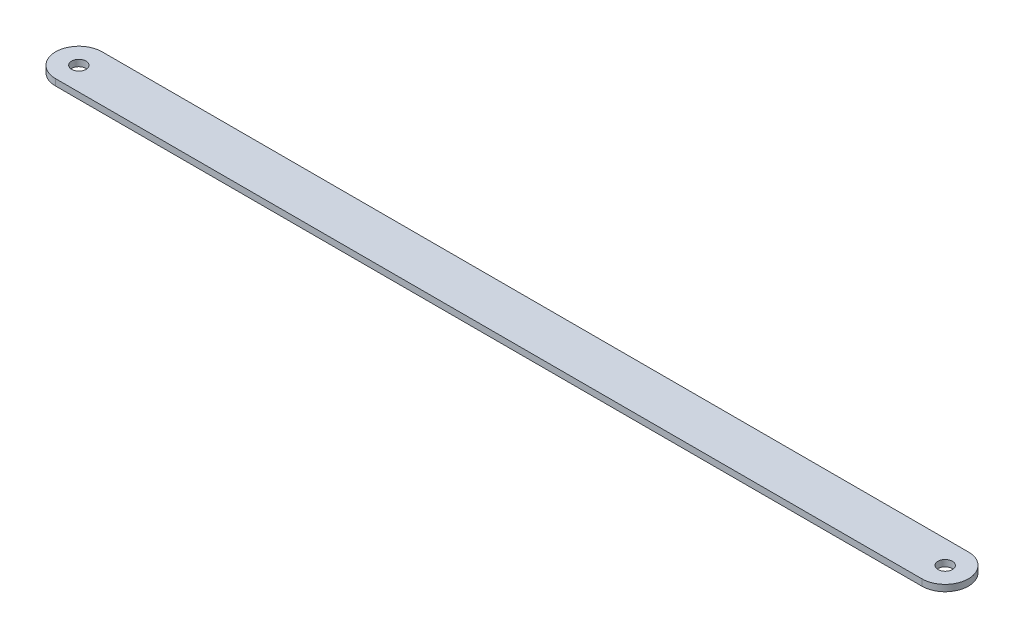
ISO-10303-21;
HEADER;
FILE_DESCRIPTION(('STEP AP214'),'2;1');
FILE_NAME('part.step','',(''),(''),'','','');
FILE_SCHEMA(('AUTOMOTIVE_DESIGN { 1 0 10303 214 1 1 1 1 }'));
ENDSEC;
DATA;
#1=APPLICATION_CONTEXT('core data for automotive mechanical design processes');
#2=APPLICATION_PROTOCOL_DEFINITION('international standard','automotive_design',2000,#1);
#3=PRODUCT_CONTEXT('',#1,'mechanical');
#4=PRODUCT('Part','Part','',(#3));
#5=PRODUCT_RELATED_PRODUCT_CATEGORY('part','',(#4));
#6=PRODUCT_DEFINITION_FORMATION('','',#4);
#7=PRODUCT_DEFINITION_CONTEXT('part definition',#1,'design');
#8=PRODUCT_DEFINITION('design','',#6,#7);
#9=PRODUCT_DEFINITION_SHAPE('','',#8);
#10=(LENGTH_UNIT() NAMED_UNIT(*) SI_UNIT(.MILLI.,.METRE.));
#11=(NAMED_UNIT(*) PLANE_ANGLE_UNIT() SI_UNIT($,.RADIAN.));
#12=(NAMED_UNIT(*) SI_UNIT($,.STERADIAN.) SOLID_ANGLE_UNIT());
#13=UNCERTAINTY_MEASURE_WITH_UNIT(LENGTH_MEASURE(1.E-05),#10,'distance_accuracy_value','');
#14=(GEOMETRIC_REPRESENTATION_CONTEXT(3) GLOBAL_UNCERTAINTY_ASSIGNED_CONTEXT((#13)) GLOBAL_UNIT_ASSIGNED_CONTEXT((#10,
#11,#12)) REPRESENTATION_CONTEXT('',''));
#15=CARTESIAN_POINT('',(0.,0.,0.));
#16=DIRECTION('',(0.,0.,1.));
#17=DIRECTION('',(1.,0.,0.));
#18=AXIS2_PLACEMENT_3D('',#15,#16,#17);
#19=CARTESIAN_POINT('',(-270.,4.,0.));
#20=DIRECTION('',(0.,-1.,0.));
#21=DIRECTION('',(0.,0.,-1.));
#22=AXIS2_PLACEMENT_3D('',#19,#20,#21);
#23=PLANE('',#22);
#24=CARTESIAN_POINT('',(270.,4.,0.));
#25=DIRECTION('',(0.,-1.,0.));
#26=DIRECTION('',(0.,0.,-1.));
#27=AXIS2_PLACEMENT_3D('',#24,#25,#26);
#28=CIRCLE('',#27,14.5);
#29=CARTESIAN_POINT('',(270.,4.,-14.5000000000001));
#30=VERTEX_POINT('',#29);
#31=CARTESIAN_POINT('',(270.,4.,14.4999999999999));
#32=VERTEX_POINT('',#31);
#33=EDGE_CURVE('E89',#30,#32,#28,.T.);
#34=ORIENTED_EDGE('',*,*,#33,.F.);
#35=DIRECTION('',(-1.,0.,0.));
#36=VECTOR('',#35,1.);
#37=CARTESIAN_POINT('',(-229.963800792768,4.,-14.5000000000001));
#38=LINE('',#37,#36);
#39=CARTESIAN_POINT('',(-270.,4.,-14.5));
#40=VERTEX_POINT('',#39);
#41=EDGE_CURVE('E50',#30,#40,#38,.T.);
#42=ORIENTED_EDGE('',*,*,#41,.T.);
#43=CARTESIAN_POINT('',(-270.,4.,0.));
#44=DIRECTION('',(0.,1.,0.));
#45=DIRECTION('',(0.,0.,-1.));
#46=AXIS2_PLACEMENT_3D('',#43,#44,#45);
#47=CIRCLE('',#46,14.5);
#48=CARTESIAN_POINT('',(-270.,4.,14.5));
#49=VERTEX_POINT('',#48);
#50=EDGE_CURVE('E110',#40,#49,#47,.T.);
#51=ORIENTED_EDGE('',*,*,#50,.T.);
#52=DIRECTION('',(1.,0.,0.));
#53=VECTOR('',#52,1.);
#54=CARTESIAN_POINT('',(-270.,4.,14.5));
#55=LINE('',#54,#53);
#56=EDGE_CURVE('E67',#49,#32,#55,.T.);
#57=ORIENTED_EDGE('',*,*,#56,.T.);
#58=EDGE_LOOP('',(#34,#42,#51,#57));
#59=FACE_BOUND('',#58,.T.);
#60=CARTESIAN_POINT('',(-270.,4.,0.));
#61=DIRECTION('',(0.,1.,0.));
#62=DIRECTION('',(0.,0.,1.));
#63=AXIS2_PLACEMENT_3D('',#60,#61,#62);
#64=CIRCLE('',#63,4.50000000000002);
#65=CARTESIAN_POINT('',(-270.,4.,4.50000000000002));
#66=VERTEX_POINT('',#65);
#67=EDGE_CURVE('E105',#66,#66,#64,.T.);
#68=ORIENTED_EDGE('',*,*,#67,.F.);
#69=EDGE_LOOP('',(#68));
#70=FACE_BOUND('',#69,.T.);
#71=CARTESIAN_POINT('',(270.,4.,0.));
#72=DIRECTION('',(0.,-1.,0.));
#73=DIRECTION('',(0.,0.,1.));
#74=AXIS2_PLACEMENT_3D('',#71,#72,#73);
#75=CIRCLE('',#74,4.50000000000002);
#76=CARTESIAN_POINT('',(270.,4.,4.49999999999995));
#77=VERTEX_POINT('',#76);
#78=EDGE_CURVE('E95',#77,#77,#75,.T.);
#79=ORIENTED_EDGE('',*,*,#78,.T.);
#80=EDGE_LOOP('',(#79));
#81=FACE_BOUND('',#80,.T.);
#82=ADVANCED_FACE('F33',(#59,#70,#81),#23,.F.);
#83=CARTESIAN_POINT('',(-270.,0.,0.));
#84=DIRECTION('',(0.,-1.,0.));
#85=DIRECTION('',(0.,0.,-1.));
#86=AXIS2_PLACEMENT_3D('',#83,#84,#85);
#87=PLANE('',#86);
#88=DIRECTION('',(-1.,0.,0.));
#89=VECTOR('',#88,1.);
#90=CARTESIAN_POINT('',(-229.963800792768,0.,-14.5000000000001));
#91=LINE('',#90,#89);
#92=CARTESIAN_POINT('',(270.,0.,-14.5000000000001));
#93=VERTEX_POINT('',#92);
#94=CARTESIAN_POINT('',(-270.,0.,-14.5));
#95=VERTEX_POINT('',#94);
#96=EDGE_CURVE('E81',#93,#95,#91,.T.);
#97=ORIENTED_EDGE('',*,*,#96,.F.);
#98=CARTESIAN_POINT('',(270.,0.,0.));
#99=DIRECTION('',(0.,-1.,0.));
#100=DIRECTION('',(0.,0.,-1.));
#101=AXIS2_PLACEMENT_3D('',#98,#99,#100);
#102=CIRCLE('',#101,14.5);
#103=CARTESIAN_POINT('',(270.,0.,14.4999999999999));
#104=VERTEX_POINT('',#103);
#105=EDGE_CURVE('E88',#93,#104,#102,.T.);
#106=ORIENTED_EDGE('',*,*,#105,.T.);
#107=DIRECTION('',(1.,0.,0.));
#108=VECTOR('',#107,1.);
#109=CARTESIAN_POINT('',(-270.,0.,14.5));
#110=LINE('',#109,#108);
#111=CARTESIAN_POINT('',(-270.,0.,14.5));
#112=VERTEX_POINT('',#111);
#113=EDGE_CURVE('E62',#112,#104,#110,.T.);
#114=ORIENTED_EDGE('',*,*,#113,.F.);
#115=CARTESIAN_POINT('',(-270.,0.,0.));
#116=DIRECTION('',(0.,1.,0.));
#117=DIRECTION('',(0.,0.,-1.));
#118=AXIS2_PLACEMENT_3D('',#115,#116,#117);
#119=CIRCLE('',#118,14.5);
#120=EDGE_CURVE('E82',#95,#112,#119,.T.);
#121=ORIENTED_EDGE('',*,*,#120,.F.);
#122=EDGE_LOOP('',(#97,#106,#114,#121));
#123=FACE_BOUND('',#122,.T.);
#124=CARTESIAN_POINT('',(-270.,0.,0.));
#125=DIRECTION('',(0.,1.,0.));
#126=DIRECTION('',(0.,0.,1.));
#127=AXIS2_PLACEMENT_3D('',#124,#125,#126);
#128=CIRCLE('',#127,4.50000000000002);
#129=CARTESIAN_POINT('',(-270.,0.,4.50000000000002));
#130=VERTEX_POINT('',#129);
#131=EDGE_CURVE('E104',#130,#130,#128,.T.);
#132=ORIENTED_EDGE('',*,*,#131,.T.);
#133=EDGE_LOOP('',(#132));
#134=FACE_BOUND('',#133,.T.);
#135=CARTESIAN_POINT('',(270.,0.,0.));
#136=DIRECTION('',(0.,-1.,0.));
#137=DIRECTION('',(0.,0.,1.));
#138=AXIS2_PLACEMENT_3D('',#135,#136,#137);
#139=CIRCLE('',#138,4.50000000000002);
#140=CARTESIAN_POINT('',(270.,0.,4.49999999999995));
#141=VERTEX_POINT('',#140);
#142=EDGE_CURVE('E99',#141,#141,#139,.T.);
#143=ORIENTED_EDGE('',*,*,#142,.F.);
#144=EDGE_LOOP('',(#143));
#145=FACE_BOUND('',#144,.T.);
#146=ADVANCED_FACE('F92',(#123,#134,#145),#87,.T.);
#147=CARTESIAN_POINT('',(-270.,4.,0.));
#148=DIRECTION('',(0.,-1.,0.));
#149=DIRECTION('',(0.,0.,-1.));
#150=AXIS2_PLACEMENT_3D('',#147,#148,#149);
#151=CYLINDRICAL_SURFACE('',#150,14.5);
#152=ORIENTED_EDGE('',*,*,#120,.T.);
#153=DIRECTION('',(0.,-1.,0.));
#154=VECTOR('',#153,1.);
#155=CARTESIAN_POINT('',(-270.,4.,14.5));
#156=LINE('',#155,#154);
#157=EDGE_CURVE('E11',#49,#112,#156,.T.);
#158=ORIENTED_EDGE('',*,*,#157,.F.);
#159=ORIENTED_EDGE('',*,*,#50,.F.);
#160=DIRECTION('',(0.,-1.,0.));
#161=VECTOR('',#160,1.);
#162=CARTESIAN_POINT('',(-270.,4.,-14.5));
#163=LINE('',#162,#161);
#164=EDGE_CURVE('E42',#40,#95,#163,.T.);
#165=ORIENTED_EDGE('',*,*,#164,.T.);
#166=EDGE_LOOP('',(#152,#158,#159,#165));
#167=FACE_BOUND('',#166,.T.);
#168=ADVANCED_FACE('F35',(#167),#151,.T.);
#169=CARTESIAN_POINT('',(-270.,4.,14.5));
#170=DIRECTION('',(0.,0.,-1.));
#171=DIRECTION('',(-1.,0.,0.));
#172=AXIS2_PLACEMENT_3D('',#169,#170,#171);
#173=PLANE('',#172);
#174=ORIENTED_EDGE('',*,*,#113,.T.);
#175=DIRECTION('',(0.,-1.,0.));
#176=VECTOR('',#175,1.);
#177=CARTESIAN_POINT('',(270.,4.,14.4999999999999));
#178=LINE('',#177,#176);
#179=EDGE_CURVE('E77',#32,#104,#178,.T.);
#180=ORIENTED_EDGE('',*,*,#179,.F.);
#181=ORIENTED_EDGE('',*,*,#56,.F.);
#182=ORIENTED_EDGE('',*,*,#157,.T.);
#183=EDGE_LOOP('',(#174,#180,#181,#182));
#184=FACE_BOUND('',#183,.T.);
#185=ADVANCED_FACE('F76',(#184),#173,.F.);
#186=CARTESIAN_POINT('',(-229.963800792768,4.,-14.5000000000001));
#187=DIRECTION('',(0.,0.,1.));
#188=DIRECTION('',(1.,0.,0.));
#189=AXIS2_PLACEMENT_3D('',#186,#187,#188);
#190=PLANE('',#189);
#191=ORIENTED_EDGE('',*,*,#96,.T.);
#192=ORIENTED_EDGE('',*,*,#164,.F.);
#193=ORIENTED_EDGE('',*,*,#41,.F.);
#194=DIRECTION('',(0.,-1.,0.));
#195=VECTOR('',#194,1.);
#196=CARTESIAN_POINT('',(270.,4.,-14.5000000000001));
#197=LINE('',#196,#195);
#198=EDGE_CURVE('E90',#30,#93,#197,.T.);
#199=ORIENTED_EDGE('',*,*,#198,.T.);
#200=EDGE_LOOP('',(#191,#192,#193,#199));
#201=FACE_BOUND('',#200,.T.);
#202=ADVANCED_FACE('F119',(#201),#190,.F.);
#203=CARTESIAN_POINT('',(-270.,4.,0.));
#204=DIRECTION('',(0.,-1.,0.));
#205=DIRECTION('',(0.,0.,-1.));
#206=AXIS2_PLACEMENT_3D('',#203,#204,#205);
#207=CYLINDRICAL_SURFACE('',#206,4.50000000000002);
#208=ORIENTED_EDGE('',*,*,#67,.T.);
#209=EDGE_LOOP('',(#208));
#210=FACE_BOUND('',#209,.T.);
#211=ORIENTED_EDGE('',*,*,#131,.F.);
#212=EDGE_LOOP('',(#211));
#213=FACE_BOUND('',#212,.T.);
#214=ADVANCED_FACE('F142',(#210,#213),#207,.F.);
#215=CARTESIAN_POINT('',(270.,4.,0.));
#216=DIRECTION('',(0.,-1.,0.));
#217=DIRECTION('',(0.,0.,-1.));
#218=AXIS2_PLACEMENT_3D('',#215,#216,#217);
#219=CYLINDRICAL_SURFACE('',#218,14.5);
#220=ORIENTED_EDGE('',*,*,#105,.F.);
#221=ORIENTED_EDGE('',*,*,#198,.F.);
#222=ORIENTED_EDGE('',*,*,#33,.T.);
#223=ORIENTED_EDGE('',*,*,#179,.T.);
#224=EDGE_LOOP('',(#220,#221,#222,#223));
#225=FACE_BOUND('',#224,.T.);
#226=ADVANCED_FACE('F86',(#225),#219,.T.);
#227=CARTESIAN_POINT('',(270.,4.,0.));
#228=DIRECTION('',(0.,-1.,0.));
#229=DIRECTION('',(0.,0.,-1.));
#230=AXIS2_PLACEMENT_3D('',#227,#228,#229);
#231=CYLINDRICAL_SURFACE('',#230,4.50000000000002);
#232=ORIENTED_EDGE('',*,*,#78,.F.);
#233=EDGE_LOOP('',(#232));
#234=FACE_BOUND('',#233,.T.);
#235=ORIENTED_EDGE('',*,*,#142,.T.);
#236=EDGE_LOOP('',(#235));
#237=FACE_BOUND('',#236,.T.);
#238=ADVANCED_FACE('F127',(#234,#237),#231,.F.);
#239=CLOSED_SHELL('',(#82,#146,#168,#185,#202,#214,#226,#238));
#240=MANIFOLD_SOLID_BREP('B2',#239);
#241=ADVANCED_BREP_SHAPE_REPRESENTATION('',(#18,#240),#14);
#242=SHAPE_DEFINITION_REPRESENTATION(#9,#241);
ENDSEC;
END-ISO-10303-21;
